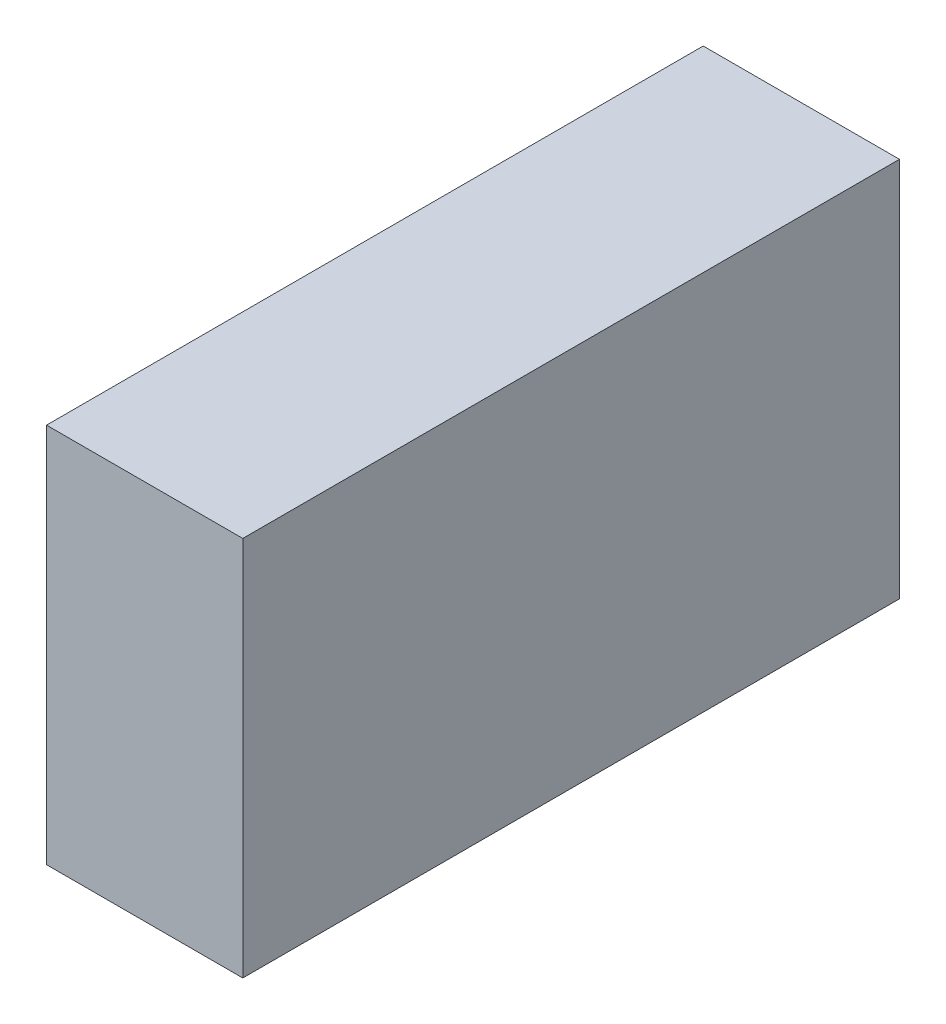
ISO-10303-21;
HEADER;
FILE_DESCRIPTION(('STEP AP214'),'2;1');
FILE_NAME('part.step','',(''),(''),'','','');
FILE_SCHEMA(('AUTOMOTIVE_DESIGN { 1 0 10303 214 1 1 1 1 }'));
ENDSEC;
DATA;
#1=APPLICATION_CONTEXT('core data for automotive mechanical design processes');
#2=APPLICATION_PROTOCOL_DEFINITION('international standard','automotive_design',2000,#1);
#3=PRODUCT_CONTEXT('',#1,'mechanical');
#4=PRODUCT('Part','Part','',(#3));
#5=PRODUCT_RELATED_PRODUCT_CATEGORY('part','',(#4));
#6=PRODUCT_DEFINITION_FORMATION('','',#4);
#7=PRODUCT_DEFINITION_CONTEXT('part definition',#1,'design');
#8=PRODUCT_DEFINITION('design','',#6,#7);
#9=PRODUCT_DEFINITION_SHAPE('','',#8);
#10=(LENGTH_UNIT() NAMED_UNIT(*) SI_UNIT(.MILLI.,.METRE.));
#11=(NAMED_UNIT(*) PLANE_ANGLE_UNIT() SI_UNIT($,.RADIAN.));
#12=(NAMED_UNIT(*) SI_UNIT($,.STERADIAN.) SOLID_ANGLE_UNIT());
#13=UNCERTAINTY_MEASURE_WITH_UNIT(LENGTH_MEASURE(1.E-05),#10,'distance_accuracy_value','');
#14=(GEOMETRIC_REPRESENTATION_CONTEXT(3) GLOBAL_UNCERTAINTY_ASSIGNED_CONTEXT((#13)) GLOBAL_UNIT_ASSIGNED_CONTEXT((#10,
#11,#12)) REPRESENTATION_CONTEXT('',''));
#15=CARTESIAN_POINT('',(0.,0.,0.));
#16=DIRECTION('',(0.,0.,1.));
#17=DIRECTION('',(1.,0.,0.));
#18=AXIS2_PLACEMENT_3D('',#15,#16,#17);
#19=CARTESIAN_POINT('',(1.27,-2.46382032,8.50000078));
#20=DIRECTION('',(0.,0.,1.));
#21=DIRECTION('',(1.,0.,0.));
#22=AXIS2_PLACEMENT_3D('',#19,#20,#21);
#23=PLANE('',#22);
#24=DIRECTION('',(0.,-1.,0.));
#25=VECTOR('',#24,1.);
#26=CARTESIAN_POINT('',(1.27,2.46382032,8.50000078));
#27=LINE('',#26,#25);
#28=CARTESIAN_POINT('',(1.27,2.46382032,8.50000078));
#29=VERTEX_POINT('',#28);
#30=CARTESIAN_POINT('',(1.27,-2.46382032,8.50000078));
#31=VERTEX_POINT('',#30);
#32=EDGE_CURVE('E19',#29,#31,#27,.T.);
#33=ORIENTED_EDGE('',*,*,#32,.F.);
#34=DIRECTION('',(1.,0.,0.));
#35=VECTOR('',#34,1.);
#36=CARTESIAN_POINT('',(-1.27,2.46382032,8.50000078));
#37=LINE('',#36,#35);
#38=CARTESIAN_POINT('',(-1.27,2.46382032,8.50000078));
#39=VERTEX_POINT('',#38);
#40=EDGE_CURVE('E84',#39,#29,#37,.T.);
#41=ORIENTED_EDGE('',*,*,#40,.F.);
#42=DIRECTION('',(0.,1.,0.));
#43=VECTOR('',#42,1.);
#44=CARTESIAN_POINT('',(-1.27,-2.46382032,8.50000078));
#45=LINE('',#44,#43);
#46=CARTESIAN_POINT('',(-1.27,-2.46382032,8.50000078));
#47=VERTEX_POINT('',#46);
#48=EDGE_CURVE('E71',#47,#39,#45,.T.);
#49=ORIENTED_EDGE('',*,*,#48,.F.);
#50=DIRECTION('',(-1.,0.,0.));
#51=VECTOR('',#50,1.);
#52=CARTESIAN_POINT('',(1.27,-2.46382032,8.50000078));
#53=LINE('',#52,#51);
#54=EDGE_CURVE('E75',#31,#47,#53,.T.);
#55=ORIENTED_EDGE('',*,*,#54,.F.);
#56=EDGE_LOOP('',(#33,#41,#49,#55));
#57=FACE_BOUND('',#56,.T.);
#58=ADVANCED_FACE('F16',(#57),#23,.T.);
#59=CARTESIAN_POINT('',(1.27,-2.46382032,0.));
#60=DIRECTION('',(0.,0.,1.));
#61=DIRECTION('',(1.,0.,0.));
#62=AXIS2_PLACEMENT_3D('',#59,#60,#61);
#63=PLANE('',#62);
#64=DIRECTION('',(-1.,0.,0.));
#65=VECTOR('',#64,1.);
#66=CARTESIAN_POINT('',(1.27,-2.46382032,0.));
#67=LINE('',#66,#65);
#68=CARTESIAN_POINT('',(1.27,-2.46382032,0.));
#69=VERTEX_POINT('',#68);
#70=CARTESIAN_POINT('',(-1.27,-2.46382032,0.));
#71=VERTEX_POINT('',#70);
#72=EDGE_CURVE('E58',#69,#71,#67,.T.);
#73=ORIENTED_EDGE('',*,*,#72,.T.);
#74=DIRECTION('',(0.,1.,0.));
#75=VECTOR('',#74,1.);
#76=CARTESIAN_POINT('',(-1.27,-2.46382032,0.));
#77=LINE('',#76,#75);
#78=CARTESIAN_POINT('',(-1.27,2.46382032,0.));
#79=VERTEX_POINT('',#78);
#80=EDGE_CURVE('E90',#71,#79,#77,.T.);
#81=ORIENTED_EDGE('',*,*,#80,.T.);
#82=DIRECTION('',(1.,0.,0.));
#83=VECTOR('',#82,1.);
#84=CARTESIAN_POINT('',(-1.27,2.46382032,0.));
#85=LINE('',#84,#83);
#86=CARTESIAN_POINT('',(1.27,2.46382032,0.));
#87=VERTEX_POINT('',#86);
#88=EDGE_CURVE('E61',#79,#87,#85,.T.);
#89=ORIENTED_EDGE('',*,*,#88,.T.);
#90=DIRECTION('',(0.,-1.,0.));
#91=VECTOR('',#90,1.);
#92=CARTESIAN_POINT('',(1.27,2.46382032,0.));
#93=LINE('',#92,#91);
#94=EDGE_CURVE('E11',#87,#69,#93,.T.);
#95=ORIENTED_EDGE('',*,*,#94,.T.);
#96=EDGE_LOOP('',(#73,#81,#89,#95));
#97=FACE_BOUND('',#96,.T.);
#98=ADVANCED_FACE('F56',(#97),#63,.F.);
#99=CARTESIAN_POINT('',(1.27,2.46382032,0.));
#100=DIRECTION('',(1.,0.,0.));
#101=DIRECTION('',(0.,1.,0.));
#102=AXIS2_PLACEMENT_3D('',#99,#100,#101);
#103=PLANE('',#102);
#104=DIRECTION('',(0.,0.,1.));
#105=VECTOR('',#104,1.);
#106=CARTESIAN_POINT('',(1.27,2.46382032,0.));
#107=LINE('',#106,#105);
#108=EDGE_CURVE('E82',#87,#29,#107,.T.);
#109=ORIENTED_EDGE('',*,*,#108,.T.);
#110=ORIENTED_EDGE('',*,*,#32,.T.);
#111=DIRECTION('',(0.,0.,1.));
#112=VECTOR('',#111,1.);
#113=CARTESIAN_POINT('',(1.27,-2.46382032,0.));
#114=LINE('',#113,#112);
#115=EDGE_CURVE('E67',#69,#31,#114,.T.);
#116=ORIENTED_EDGE('',*,*,#115,.F.);
#117=ORIENTED_EDGE('',*,*,#94,.F.);
#118=EDGE_LOOP('',(#109,#110,#116,#117));
#119=FACE_BOUND('',#118,.T.);
#120=ADVANCED_FACE('F73',(#119),#103,.T.);
#121=CARTESIAN_POINT('',(-1.27,2.46382032,0.));
#122=DIRECTION('',(0.,1.,0.));
#123=DIRECTION('',(1.,0.,0.));
#124=AXIS2_PLACEMENT_3D('',#121,#122,#123);
#125=PLANE('',#124);
#126=DIRECTION('',(0.,0.,1.));
#127=VECTOR('',#126,1.);
#128=CARTESIAN_POINT('',(-1.27,2.46382032,0.));
#129=LINE('',#128,#127);
#130=EDGE_CURVE('E86',#79,#39,#129,.T.);
#131=ORIENTED_EDGE('',*,*,#130,.T.);
#132=ORIENTED_EDGE('',*,*,#40,.T.);
#133=ORIENTED_EDGE('',*,*,#108,.F.);
#134=ORIENTED_EDGE('',*,*,#88,.F.);
#135=EDGE_LOOP('',(#131,#132,#133,#134));
#136=FACE_BOUND('',#135,.T.);
#137=ADVANCED_FACE('F112',(#136),#125,.T.);
#138=CARTESIAN_POINT('',(-1.27,-2.46382032,0.));
#139=DIRECTION('',(-1.,0.,0.));
#140=DIRECTION('',(0.,0.,1.));
#141=AXIS2_PLACEMENT_3D('',#138,#139,#140);
#142=PLANE('',#141);
#143=DIRECTION('',(0.,0.,1.));
#144=VECTOR('',#143,1.);
#145=CARTESIAN_POINT('',(-1.27,-2.46382032,0.));
#146=LINE('',#145,#144);
#147=EDGE_CURVE('E69',#71,#47,#146,.T.);
#148=ORIENTED_EDGE('',*,*,#147,.T.);
#149=ORIENTED_EDGE('',*,*,#48,.T.);
#150=ORIENTED_EDGE('',*,*,#130,.F.);
#151=ORIENTED_EDGE('',*,*,#80,.F.);
#152=EDGE_LOOP('',(#148,#149,#150,#151));
#153=FACE_BOUND('',#152,.T.);
#154=ADVANCED_FACE('F110',(#153),#142,.T.);
#155=CARTESIAN_POINT('',(1.27,-2.46382032,0.));
#156=DIRECTION('',(0.,-1.,0.));
#157=DIRECTION('',(0.,0.,-1.));
#158=AXIS2_PLACEMENT_3D('',#155,#156,#157);
#159=PLANE('',#158);
#160=ORIENTED_EDGE('',*,*,#115,.T.);
#161=ORIENTED_EDGE('',*,*,#54,.T.);
#162=ORIENTED_EDGE('',*,*,#147,.F.);
#163=ORIENTED_EDGE('',*,*,#72,.F.);
#164=EDGE_LOOP('',(#160,#161,#162,#163));
#165=FACE_BOUND('',#164,.T.);
#166=ADVANCED_FACE('F65',(#165),#159,.T.);
#167=CLOSED_SHELL('',(#58,#98,#120,#137,#154,#166));
#168=MANIFOLD_SOLID_BREP('B1',#167);
#169=ADVANCED_BREP_SHAPE_REPRESENTATION('',(#18,#168),#14);
#170=SHAPE_DEFINITION_REPRESENTATION(#9,#169);
ENDSEC;
END-ISO-10303-21;
